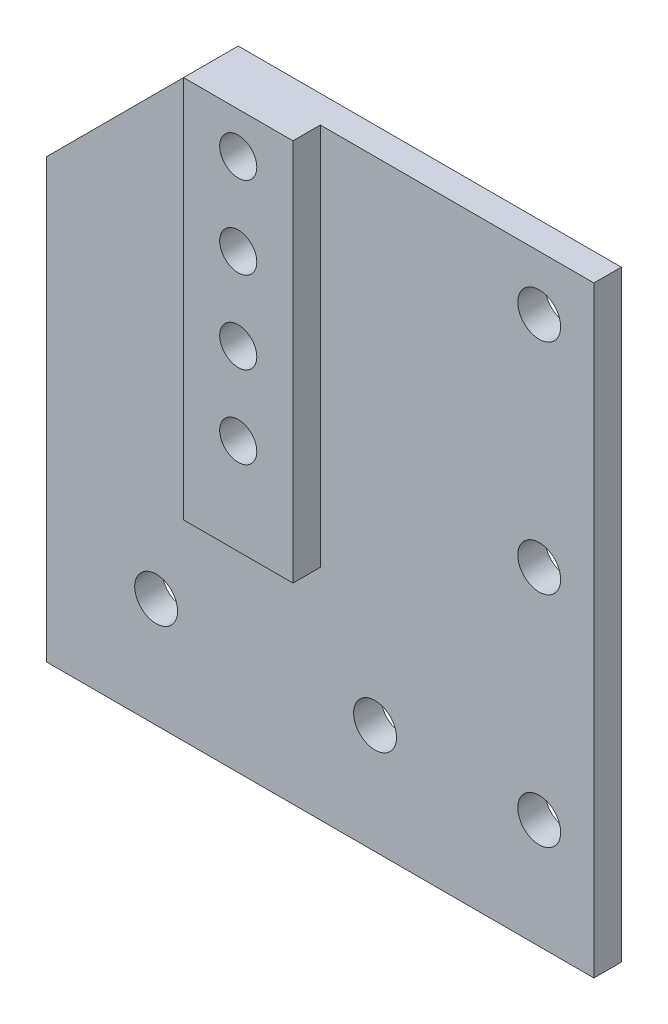
ISO-10303-21;
HEADER;
FILE_DESCRIPTION(('STEP AP214'),'2;1');
FILE_NAME('part.step','',(''),(''),'','','');
FILE_SCHEMA(('AUTOMOTIVE_DESIGN { 1 0 10303 214 1 1 1 1 }'));
ENDSEC;
DATA;
#1=APPLICATION_CONTEXT('core data for automotive mechanical design processes');
#2=APPLICATION_PROTOCOL_DEFINITION('international standard','automotive_design',2000,#1);
#3=PRODUCT_CONTEXT('',#1,'mechanical');
#4=PRODUCT('Part','Part','',(#3));
#5=PRODUCT_RELATED_PRODUCT_CATEGORY('part','',(#4));
#6=PRODUCT_DEFINITION_FORMATION('','',#4);
#7=PRODUCT_DEFINITION_CONTEXT('part definition',#1,'design');
#8=PRODUCT_DEFINITION('design','',#6,#7);
#9=PRODUCT_DEFINITION_SHAPE('','',#8);
#10=(LENGTH_UNIT() NAMED_UNIT(*) SI_UNIT(.MILLI.,.METRE.));
#11=(NAMED_UNIT(*) PLANE_ANGLE_UNIT() SI_UNIT($,.RADIAN.));
#12=(NAMED_UNIT(*) SI_UNIT($,.STERADIAN.) SOLID_ANGLE_UNIT());
#13=UNCERTAINTY_MEASURE_WITH_UNIT(LENGTH_MEASURE(1.E-05),#10,'distance_accuracy_value','');
#14=(GEOMETRIC_REPRESENTATION_CONTEXT(3) GLOBAL_UNCERTAINTY_ASSIGNED_CONTEXT((#13)) GLOBAL_UNIT_ASSIGNED_CONTEXT((#10,
#11,#12)) REPRESENTATION_CONTEXT('',''));
#15=CARTESIAN_POINT('',(0.,0.,0.));
#16=DIRECTION('',(0.,0.,1.));
#17=DIRECTION('',(1.,0.,0.));
#18=AXIS2_PLACEMENT_3D('',#15,#16,#17);
#19=CARTESIAN_POINT('',(0.,0.,3.175));
#20=DIRECTION('',(0.,0.,-1.));
#21=DIRECTION('',(-1.,0.,0.));
#22=AXIS2_PLACEMENT_3D('',#19,#20,#21);
#23=PLANE('',#22);
#24=CARTESIAN_POINT('',(-273.050000508,50.8000000000182,3.175));
#25=DIRECTION('',(0.,0.,1.));
#26=DIRECTION('',(1.,0.,0.));
#27=AXIS2_PLACEMENT_3D('',#24,#25,#26);
#28=CIRCLE('',#27,2.48919999999997);
#29=CARTESIAN_POINT('',(-270.560800508,50.8000000000182,3.175));
#30=VERTEX_POINT('',#29);
#31=EDGE_CURVE('E141',#30,#30,#28,.T.);
#32=ORIENTED_EDGE('',*,*,#31,.F.);
#33=EDGE_LOOP('',(#32));
#34=FACE_BOUND('',#33,.T.);
#35=CARTESIAN_POINT('',(-292.100000508,-4.02802791121815E-12,3.175));
#36=DIRECTION('',(0.,0.,1.));
#37=DIRECTION('',(1.,0.,0.));
#38=AXIS2_PLACEMENT_3D('',#35,#36,#37);
#39=CIRCLE('',#38,2.48919999999997);
#40=CARTESIAN_POINT('',(-289.610800508,-4.02802791121815E-12,3.175));
#41=VERTEX_POINT('',#40);
#42=EDGE_CURVE('E181',#41,#41,#39,.T.);
#43=ORIENTED_EDGE('',*,*,#42,.F.);
#44=EDGE_LOOP('',(#43));
#45=FACE_BOUND('',#44,.T.);
#46=CARTESIAN_POINT('',(-317.500000508,-4.02802791121815E-12,3.175));
#47=DIRECTION('',(0.,0.,1.));
#48=DIRECTION('',(1.,0.,0.));
#49=AXIS2_PLACEMENT_3D('',#46,#47,#48);
#50=CIRCLE('',#49,2.48919999999997);
#51=CARTESIAN_POINT('',(-315.010800508,-4.02802791121815E-12,3.175));
#52=VERTEX_POINT('',#51);
#53=EDGE_CURVE('E173',#52,#52,#50,.T.);
#54=ORIENTED_EDGE('',*,*,#53,.F.);
#55=EDGE_LOOP('',(#54));
#56=FACE_BOUND('',#55,.T.);
#57=CARTESIAN_POINT('',(-273.050000508,1.79465004055551E-11,3.175));
#58=DIRECTION('',(0.,0.,1.));
#59=DIRECTION('',(1.,0.,0.));
#60=AXIS2_PLACEMENT_3D('',#57,#58,#59);
#61=CIRCLE('',#60,2.48919999999997);
#62=CARTESIAN_POINT('',(-270.560800508,1.79465004055551E-11,3.175));
#63=VERTEX_POINT('',#62);
#64=EDGE_CURVE('E165',#63,#63,#61,.T.);
#65=ORIENTED_EDGE('',*,*,#64,.F.);
#66=EDGE_LOOP('',(#65));
#67=FACE_BOUND('',#66,.T.);
#68=CARTESIAN_POINT('',(-273.050000508,25.400000000017,3.175));
#69=DIRECTION('',(0.,0.,1.));
#70=DIRECTION('',(1.,0.,0.));
#71=AXIS2_PLACEMENT_3D('',#68,#69,#70);
#72=CIRCLE('',#71,2.48919999999997);
#73=CARTESIAN_POINT('',(-270.560800508,25.400000000017,3.175));
#74=VERTEX_POINT('',#73);
#75=EDGE_CURVE('E157',#74,#74,#72,.T.);
#76=ORIENTED_EDGE('',*,*,#75,.F.);
#77=EDGE_LOOP('',(#76));
#78=FACE_BOUND('',#77,.T.);
#79=DIRECTION('',(0.,1.,0.));
#80=VECTOR('',#79,1.);
#81=CARTESIAN_POINT('',(-298.450000508,12.6999999999997,3.175));
#82=LINE('',#81,#80);
#83=CARTESIAN_POINT('',(-298.450000508,12.6999999999997,3.175));
#84=VERTEX_POINT('',#83);
#85=CARTESIAN_POINT('',(-298.450000508,57.1499999999997,3.175));
#86=VERTEX_POINT('',#85);
#87=EDGE_CURVE('E61',#84,#86,#82,.T.);
#88=ORIENTED_EDGE('',*,*,#87,.F.);
#89=DIRECTION('',(1.,0.,0.));
#90=VECTOR('',#89,1.);
#91=CARTESIAN_POINT('',(-311.150000508,12.6999999999997,3.175));
#92=LINE('',#91,#90);
#93=CARTESIAN_POINT('',(-311.150000508,12.6999999999997,3.175));
#94=VERTEX_POINT('',#93);
#95=EDGE_CURVE('E253',#94,#84,#92,.T.);
#96=ORIENTED_EDGE('',*,*,#95,.F.);
#97=DIRECTION('',(0.,-1.,0.));
#98=VECTOR('',#97,1.);
#99=CARTESIAN_POINT('',(-311.150000508,57.1499999999997,3.175));
#100=LINE('',#99,#98);
#101=CARTESIAN_POINT('',(-311.150000508,57.1499999999997,3.175));
#102=VERTEX_POINT('',#101);
#103=EDGE_CURVE('E252',#102,#94,#100,.T.);
#104=ORIENTED_EDGE('',*,*,#103,.F.);
#105=DIRECTION('',(-0.707106781186543,-0.707106781186552,0.));
#106=VECTOR('',#105,1.);
#107=CARTESIAN_POINT('',(-311.150000508,57.1499999999997,3.175));
#108=LINE('',#107,#106);
#109=CARTESIAN_POINT('',(-330.200000508,38.0999999999996,3.175));
#110=VERTEX_POINT('',#109);
#111=EDGE_CURVE('E199',#102,#110,#108,.T.);
#112=ORIENTED_EDGE('',*,*,#111,.T.);
#113=DIRECTION('',(0.,-1.,0.));
#114=VECTOR('',#113,1.);
#115=CARTESIAN_POINT('',(-330.200000508,12.6999999999996,3.175));
#116=LINE('',#115,#114);
#117=CARTESIAN_POINT('',(-330.200000508,-12.7000000000004,3.175));
#118=VERTEX_POINT('',#117);
#119=EDGE_CURVE('E202',#110,#118,#116,.T.);
#120=ORIENTED_EDGE('',*,*,#119,.T.);
#121=DIRECTION('',(1.,0.,0.));
#122=VECTOR('',#121,1.);
#123=CARTESIAN_POINT('',(-279.400000508,-12.7000000000001,3.175));
#124=LINE('',#123,#122);
#125=CARTESIAN_POINT('',(-266.700000508,-12.7,3.175));
#126=VERTEX_POINT('',#125);
#127=EDGE_CURVE('E190',#118,#126,#124,.T.);
#128=ORIENTED_EDGE('',*,*,#127,.T.);
#129=DIRECTION('',(0.,1.,0.));
#130=VECTOR('',#129,1.);
#131=CARTESIAN_POINT('',(-266.700000508,-12.7,3.175));
#132=LINE('',#131,#130);
#133=CARTESIAN_POINT('',(-266.700000508,57.1499999999999,3.175));
#134=VERTEX_POINT('',#133);
#135=EDGE_CURVE('E193',#126,#134,#132,.T.);
#136=ORIENTED_EDGE('',*,*,#135,.T.);
#137=DIRECTION('',(-1.,0.,0.));
#138=VECTOR('',#137,1.);
#139=CARTESIAN_POINT('',(-266.700000508,57.1499999999999,3.175));
#140=LINE('',#139,#138);
#141=EDGE_CURVE('E66',#134,#86,#140,.T.);
#142=ORIENTED_EDGE('',*,*,#141,.T.);
#143=EDGE_LOOP('',(#88,#96,#104,#112,#120,#128,#136,#142));
#144=FACE_BOUND('',#143,.T.);
#145=ADVANCED_FACE('F45',(#34,#45,#56,#67,#78,#144),#23,.F.);
#146=CARTESIAN_POINT('',(0.,0.,0.));
#147=DIRECTION('',(0.,0.,-1.));
#148=DIRECTION('',(-1.,0.,0.));
#149=AXIS2_PLACEMENT_3D('',#146,#147,#148);
#150=PLANE('',#149);
#151=CARTESIAN_POINT('',(-304.800000508,42.8624999999998,0.));
#152=DIRECTION('',(0.,0.,1.));
#153=DIRECTION('',(1.,0.,0.));
#154=AXIS2_PLACEMENT_3D('',#151,#152,#153);
#155=CIRCLE('',#154,2.15264999999998);
#156=CARTESIAN_POINT('',(-302.647350508,42.8624999999998,0.));
#157=VERTEX_POINT('',#156);
#158=EDGE_CURVE('E305',#157,#157,#155,.T.);
#159=ORIENTED_EDGE('',*,*,#158,.T.);
#160=EDGE_LOOP('',(#159));
#161=FACE_BOUND('',#160,.T.);
#162=CARTESIAN_POINT('',(-304.800000508,52.3874999999998,0.));
#163=DIRECTION('',(0.,0.,1.));
#164=DIRECTION('',(1.,0.,0.));
#165=AXIS2_PLACEMENT_3D('',#162,#163,#164);
#166=CIRCLE('',#165,2.15264999999998);
#167=CARTESIAN_POINT('',(-302.647350508,52.3874999999998,0.));
#168=VERTEX_POINT('',#167);
#169=EDGE_CURVE('E297',#168,#168,#166,.T.);
#170=ORIENTED_EDGE('',*,*,#169,.T.);
#171=EDGE_LOOP('',(#170));
#172=FACE_BOUND('',#171,.T.);
#173=CARTESIAN_POINT('',(-304.800000508,33.3374999999998,0.));
#174=DIRECTION('',(0.,0.,1.));
#175=DIRECTION('',(1.,0.,0.));
#176=AXIS2_PLACEMENT_3D('',#173,#174,#175);
#177=CIRCLE('',#176,2.15264999999998);
#178=CARTESIAN_POINT('',(-302.647350508,33.3374999999998,0.));
#179=VERTEX_POINT('',#178);
#180=EDGE_CURVE('E289',#179,#179,#177,.T.);
#181=ORIENTED_EDGE('',*,*,#180,.T.);
#182=EDGE_LOOP('',(#181));
#183=FACE_BOUND('',#182,.T.);
#184=CARTESIAN_POINT('',(-304.800000508,23.8124999999998,0.));
#185=DIRECTION('',(0.,0.,1.));
#186=DIRECTION('',(1.,0.,0.));
#187=AXIS2_PLACEMENT_3D('',#184,#185,#186);
#188=CIRCLE('',#187,2.15264999999998);
#189=CARTESIAN_POINT('',(-302.647350508,23.8124999999998,0.));
#190=VERTEX_POINT('',#189);
#191=EDGE_CURVE('E255',#190,#190,#188,.T.);
#192=ORIENTED_EDGE('',*,*,#191,.T.);
#193=EDGE_LOOP('',(#192));
#194=FACE_BOUND('',#193,.T.);
#195=CARTESIAN_POINT('',(-273.050000508,50.8000000000182,0.));
#196=DIRECTION('',(0.,0.,1.));
#197=DIRECTION('',(1.,0.,0.));
#198=AXIS2_PLACEMENT_3D('',#195,#196,#197);
#199=CIRCLE('',#198,2.48920000000002);
#200=CARTESIAN_POINT('',(-270.560800508,50.8000000000182,0.));
#201=VERTEX_POINT('',#200);
#202=EDGE_CURVE('E148',#201,#201,#199,.T.);
#203=ORIENTED_EDGE('',*,*,#202,.T.);
#204=EDGE_LOOP('',(#203));
#205=FACE_BOUND('',#204,.T.);
#206=CARTESIAN_POINT('',(-273.050000508,25.400000000017,0.));
#207=DIRECTION('',(0.,0.,1.));
#208=DIRECTION('',(1.,0.,0.));
#209=AXIS2_PLACEMENT_3D('',#206,#207,#208);
#210=CIRCLE('',#209,2.48920000000002);
#211=CARTESIAN_POINT('',(-270.560800508,25.400000000017,0.));
#212=VERTEX_POINT('',#211);
#213=EDGE_CURVE('E161',#212,#212,#210,.T.);
#214=ORIENTED_EDGE('',*,*,#213,.T.);
#215=EDGE_LOOP('',(#214));
#216=FACE_BOUND('',#215,.T.);
#217=DIRECTION('',(1.,0.,0.));
#218=VECTOR('',#217,1.);
#219=CARTESIAN_POINT('',(-279.400000508,-12.7000000000001,0.));
#220=LINE('',#219,#218);
#221=CARTESIAN_POINT('',(-330.200000508,-12.7000000000004,0.));
#222=VERTEX_POINT('',#221);
#223=CARTESIAN_POINT('',(-266.700000508,-12.7,0.));
#224=VERTEX_POINT('',#223);
#225=EDGE_CURVE('E189',#222,#224,#220,.T.);
#226=ORIENTED_EDGE('',*,*,#225,.F.);
#227=DIRECTION('',(0.,-1.,0.));
#228=VECTOR('',#227,1.);
#229=CARTESIAN_POINT('',(-330.200000508,-12.7000000000004,0.));
#230=LINE('',#229,#228);
#231=CARTESIAN_POINT('',(-330.200000508,38.0999999999996,0.));
#232=VERTEX_POINT('',#231);
#233=EDGE_CURVE('E194',#232,#222,#230,.T.);
#234=ORIENTED_EDGE('',*,*,#233,.F.);
#235=DIRECTION('',(-0.707106781186543,-0.707106781186552,0.));
#236=VECTOR('',#235,1.);
#237=CARTESIAN_POINT('',(-311.150000508,57.1499999999997,0.));
#238=LINE('',#237,#236);
#239=CARTESIAN_POINT('',(-311.150000508,57.1499999999997,0.));
#240=VERTEX_POINT('',#239);
#241=EDGE_CURVE('E215',#240,#232,#238,.T.);
#242=ORIENTED_EDGE('',*,*,#241,.F.);
#243=DIRECTION('',(-1.,0.,0.));
#244=VECTOR('',#243,1.);
#245=CARTESIAN_POINT('',(-279.400000508,57.1499999999999,0.));
#246=LINE('',#245,#244);
#247=CARTESIAN_POINT('',(-266.700000508,57.1499999999999,0.));
#248=VERTEX_POINT('',#247);
#249=EDGE_CURVE('E212',#248,#240,#246,.T.);
#250=ORIENTED_EDGE('',*,*,#249,.F.);
#251=DIRECTION('',(0.,1.,0.));
#252=VECTOR('',#251,1.);
#253=CARTESIAN_POINT('',(-266.700000508,-12.7,0.));
#254=LINE('',#253,#252);
#255=EDGE_CURVE('E208',#224,#248,#254,.T.);
#256=ORIENTED_EDGE('',*,*,#255,.F.);
#257=EDGE_LOOP('',(#226,#234,#242,#250,#256));
#258=FACE_BOUND('',#257,.T.);
#259=CARTESIAN_POINT('',(-292.100000508,-4.02802791121815E-12,0.));
#260=DIRECTION('',(0.,0.,1.));
#261=DIRECTION('',(1.,0.,0.));
#262=AXIS2_PLACEMENT_3D('',#259,#260,#261);
#263=CIRCLE('',#262,2.48920000000002);
#264=CARTESIAN_POINT('',(-289.610800508,-4.02802791121815E-12,0.));
#265=VERTEX_POINT('',#264);
#266=EDGE_CURVE('E185',#265,#265,#263,.T.);
#267=ORIENTED_EDGE('',*,*,#266,.T.);
#268=EDGE_LOOP('',(#267));
#269=FACE_BOUND('',#268,.T.);
#270=CARTESIAN_POINT('',(-317.500000508,-4.02802791121815E-12,0.));
#271=DIRECTION('',(0.,0.,1.));
#272=DIRECTION('',(1.,0.,0.));
#273=AXIS2_PLACEMENT_3D('',#270,#271,#272);
#274=CIRCLE('',#273,2.48920000000002);
#275=CARTESIAN_POINT('',(-315.010800508,-4.02802791121815E-12,0.));
#276=VERTEX_POINT('',#275);
#277=EDGE_CURVE('E177',#276,#276,#274,.T.);
#278=ORIENTED_EDGE('',*,*,#277,.T.);
#279=EDGE_LOOP('',(#278));
#280=FACE_BOUND('',#279,.T.);
#281=CARTESIAN_POINT('',(-273.050000508,1.79465004055551E-11,0.));
#282=DIRECTION('',(0.,0.,1.));
#283=DIRECTION('',(1.,0.,0.));
#284=AXIS2_PLACEMENT_3D('',#281,#282,#283);
#285=CIRCLE('',#284,2.48920000000002);
#286=CARTESIAN_POINT('',(-270.560800508,1.79465004055551E-11,0.));
#287=VERTEX_POINT('',#286);
#288=EDGE_CURVE('E169',#287,#287,#285,.T.);
#289=ORIENTED_EDGE('',*,*,#288,.T.);
#290=EDGE_LOOP('',(#289));
#291=FACE_BOUND('',#290,.T.);
#292=ADVANCED_FACE('F241',(#161,#172,#183,#194,#205,#216,#258,#269,#280,#291),#150,.T.);
#293=CARTESIAN_POINT('',(-279.400000508,-12.7000000000001,3.175));
#294=DIRECTION('',(0.,1.,0.));
#295=DIRECTION('',(-1.,0.,0.));
#296=AXIS2_PLACEMENT_3D('',#293,#294,#295);
#297=PLANE('',#296);
#298=ORIENTED_EDGE('',*,*,#225,.T.);
#299=DIRECTION('',(0.,0.,-1.));
#300=VECTOR('',#299,1.);
#301=CARTESIAN_POINT('',(-266.700000508,-12.7,3.175));
#302=LINE('',#301,#300);
#303=EDGE_CURVE('E11',#126,#224,#302,.T.);
#304=ORIENTED_EDGE('',*,*,#303,.F.);
#305=ORIENTED_EDGE('',*,*,#127,.F.);
#306=DIRECTION('',(0.,0.,-1.));
#307=VECTOR('',#306,1.);
#308=CARTESIAN_POINT('',(-330.200000508,-12.7000000000004,3.175));
#309=LINE('',#308,#307);
#310=EDGE_CURVE('E205',#118,#222,#309,.T.);
#311=ORIENTED_EDGE('',*,*,#310,.T.);
#312=EDGE_LOOP('',(#298,#304,#305,#311));
#313=FACE_BOUND('',#312,.T.);
#314=ADVANCED_FACE('F47',(#313),#297,.F.);
#315=CARTESIAN_POINT('',(-266.700000508,-12.7,3.175));
#316=DIRECTION('',(-1.,0.,0.));
#317=DIRECTION('',(0.,-1.,0.));
#318=AXIS2_PLACEMENT_3D('',#315,#316,#317);
#319=PLANE('',#318);
#320=ORIENTED_EDGE('',*,*,#255,.T.);
#321=DIRECTION('',(0.,0.,-1.));
#322=VECTOR('',#321,1.);
#323=CARTESIAN_POINT('',(-266.700000508,57.1499999999999,3.175));
#324=LINE('',#323,#322);
#325=EDGE_CURVE('E54',#134,#248,#324,.T.);
#326=ORIENTED_EDGE('',*,*,#325,.F.);
#327=ORIENTED_EDGE('',*,*,#135,.F.);
#328=ORIENTED_EDGE('',*,*,#303,.T.);
#329=EDGE_LOOP('',(#320,#326,#327,#328));
#330=FACE_BOUND('',#329,.T.);
#331=ADVANCED_FACE('F237',(#330),#319,.F.);
#332=CARTESIAN_POINT('',(-279.400000508,57.1499999999999,3.175));
#333=DIRECTION('',(0.,-1.,0.));
#334=DIRECTION('',(1.,0.,0.));
#335=AXIS2_PLACEMENT_3D('',#332,#333,#334);
#336=PLANE('',#335);
#337=ORIENTED_EDGE('',*,*,#249,.T.);
#338=DIRECTION('',(0.,0.,-1.));
#339=VECTOR('',#338,1.);
#340=CARTESIAN_POINT('',(-311.150000508,57.1499999999997,3.175));
#341=LINE('',#340,#339);
#342=EDGE_CURVE('E138',#102,#240,#341,.T.);
#343=ORIENTED_EDGE('',*,*,#342,.F.);
#344=DIRECTION('',(0.,0.,-1.));
#345=VECTOR('',#344,1.);
#346=CARTESIAN_POINT('',(-311.150000508,57.1499999999997,6.35));
#347=LINE('',#346,#345);
#348=CARTESIAN_POINT('',(-311.150000508,57.1499999999997,6.35));
#349=VERTEX_POINT('',#348);
#350=EDGE_CURVE('E117',#349,#102,#347,.T.);
#351=ORIENTED_EDGE('',*,*,#350,.F.);
#352=DIRECTION('',(-1.,0.,0.));
#353=VECTOR('',#352,1.);
#354=CARTESIAN_POINT('',(-298.450000508,57.1499999999999,6.35));
#355=LINE('',#354,#353);
#356=CARTESIAN_POINT('',(-298.450000508,57.1499999999999,6.35));
#357=VERTEX_POINT('',#356);
#358=EDGE_CURVE('E124',#357,#349,#355,.T.);
#359=ORIENTED_EDGE('',*,*,#358,.F.);
#360=DIRECTION('',(0.,0.,-1.));
#361=VECTOR('',#360,1.);
#362=CARTESIAN_POINT('',(-298.450000508,57.1499999999999,6.35));
#363=LINE('',#362,#361);
#364=EDGE_CURVE('E270',#357,#86,#363,.T.);
#365=ORIENTED_EDGE('',*,*,#364,.T.);
#366=ORIENTED_EDGE('',*,*,#141,.F.);
#367=ORIENTED_EDGE('',*,*,#325,.T.);
#368=EDGE_LOOP('',(#337,#343,#351,#359,#365,#366,#367));
#369=FACE_BOUND('',#368,.T.);
#370=ADVANCED_FACE('F136',(#369),#336,.F.);
#371=CARTESIAN_POINT('',(-311.150000508,57.1499999999997,3.175));
#372=DIRECTION('',(0.707106781186552,-0.707106781186543,0.));
#373=DIRECTION('',(0.707106781186543,0.707106781186552,0.));
#374=AXIS2_PLACEMENT_3D('',#371,#372,#373);
#375=PLANE('',#374);
#376=ORIENTED_EDGE('',*,*,#241,.T.);
#377=DIRECTION('',(0.,0.,-1.));
#378=VECTOR('',#377,1.);
#379=CARTESIAN_POINT('',(-330.200000508,38.0999999999996,3.175));
#380=LINE('',#379,#378);
#381=EDGE_CURVE('E225',#110,#232,#380,.T.);
#382=ORIENTED_EDGE('',*,*,#381,.F.);
#383=ORIENTED_EDGE('',*,*,#111,.F.);
#384=ORIENTED_EDGE('',*,*,#342,.T.);
#385=EDGE_LOOP('',(#376,#382,#383,#384));
#386=FACE_BOUND('',#385,.T.);
#387=ADVANCED_FACE('F246',(#386),#375,.F.);
#388=CARTESIAN_POINT('',(-330.200000508,-12.7000000000004,3.175));
#389=DIRECTION('',(1.,0.,0.));
#390=DIRECTION('',(0.,1.,0.));
#391=AXIS2_PLACEMENT_3D('',#388,#389,#390);
#392=PLANE('',#391);
#393=ORIENTED_EDGE('',*,*,#233,.T.);
#394=ORIENTED_EDGE('',*,*,#310,.F.);
#395=ORIENTED_EDGE('',*,*,#119,.F.);
#396=ORIENTED_EDGE('',*,*,#381,.T.);
#397=EDGE_LOOP('',(#393,#394,#395,#396));
#398=FACE_BOUND('',#397,.T.);
#399=ADVANCED_FACE('F249',(#398),#392,.F.);
#400=CARTESIAN_POINT('',(-292.100000508,-4.02802791121815E-12,3.175));
#401=DIRECTION('',(0.,0.,1.));
#402=DIRECTION('',(1.,0.,0.));
#403=AXIS2_PLACEMENT_3D('',#400,#401,#402);
#404=CYLINDRICAL_SURFACE('',#403,2.4892);
#405=ORIENTED_EDGE('',*,*,#266,.F.);
#406=EDGE_LOOP('',(#405));
#407=FACE_BOUND('',#406,.T.);
#408=ORIENTED_EDGE('',*,*,#42,.T.);
#409=EDGE_LOOP('',(#408));
#410=FACE_BOUND('',#409,.T.);
#411=ADVANCED_FACE('F350',(#407,#410),#404,.F.);
#412=CARTESIAN_POINT('',(-317.500000508,-4.02802791121815E-12,3.175));
#413=DIRECTION('',(0.,0.,1.));
#414=DIRECTION('',(1.,0.,0.));
#415=AXIS2_PLACEMENT_3D('',#412,#413,#414);
#416=CYLINDRICAL_SURFACE('',#415,2.4892);
#417=ORIENTED_EDGE('',*,*,#277,.F.);
#418=EDGE_LOOP('',(#417));
#419=FACE_BOUND('',#418,.T.);
#420=ORIENTED_EDGE('',*,*,#53,.T.);
#421=EDGE_LOOP('',(#420));
#422=FACE_BOUND('',#421,.T.);
#423=ADVANCED_FACE('F476',(#419,#422),#416,.F.);
#424=CARTESIAN_POINT('',(-273.050000508,1.79465004055551E-11,3.175));
#425=DIRECTION('',(0.,0.,1.));
#426=DIRECTION('',(1.,0.,0.));
#427=AXIS2_PLACEMENT_3D('',#424,#425,#426);
#428=CYLINDRICAL_SURFACE('',#427,2.4892);
#429=ORIENTED_EDGE('',*,*,#288,.F.);
#430=EDGE_LOOP('',(#429));
#431=FACE_BOUND('',#430,.T.);
#432=ORIENTED_EDGE('',*,*,#64,.T.);
#433=EDGE_LOOP('',(#432));
#434=FACE_BOUND('',#433,.T.);
#435=ADVANCED_FACE('F466',(#431,#434),#428,.F.);
#436=CARTESIAN_POINT('',(-273.050000508,25.400000000017,3.175));
#437=DIRECTION('',(0.,0.,1.));
#438=DIRECTION('',(1.,0.,0.));
#439=AXIS2_PLACEMENT_3D('',#436,#437,#438);
#440=CYLINDRICAL_SURFACE('',#439,2.4892);
#441=ORIENTED_EDGE('',*,*,#213,.F.);
#442=EDGE_LOOP('',(#441));
#443=FACE_BOUND('',#442,.T.);
#444=ORIENTED_EDGE('',*,*,#75,.T.);
#445=EDGE_LOOP('',(#444));
#446=FACE_BOUND('',#445,.T.);
#447=ADVANCED_FACE('F456',(#443,#446),#440,.F.);
#448=CARTESIAN_POINT('',(-273.050000508,50.8000000000182,3.175));
#449=DIRECTION('',(0.,0.,1.));
#450=DIRECTION('',(1.,0.,0.));
#451=AXIS2_PLACEMENT_3D('',#448,#449,#450);
#452=CYLINDRICAL_SURFACE('',#451,2.4892);
#453=ORIENTED_EDGE('',*,*,#202,.F.);
#454=EDGE_LOOP('',(#453));
#455=FACE_BOUND('',#454,.T.);
#456=ORIENTED_EDGE('',*,*,#31,.T.);
#457=EDGE_LOOP('',(#456));
#458=FACE_BOUND('',#457,.T.);
#459=ADVANCED_FACE('F441',(#455,#458),#452,.F.);
#460=CARTESIAN_POINT('',(-311.150000508,57.1499999999997,6.35));
#461=DIRECTION('',(1.,0.,0.));
#462=DIRECTION('',(0.,0.,-1.));
#463=AXIS2_PLACEMENT_3D('',#460,#461,#462);
#464=PLANE('',#463);
#465=ORIENTED_EDGE('',*,*,#103,.T.);
#466=DIRECTION('',(0.,0.,-1.));
#467=VECTOR('',#466,1.);
#468=CARTESIAN_POINT('',(-311.150000508,12.6999999999997,6.35));
#469=LINE('',#468,#467);
#470=CARTESIAN_POINT('',(-311.150000508,12.6999999999997,6.35));
#471=VERTEX_POINT('',#470);
#472=EDGE_CURVE('E119',#471,#94,#469,.T.);
#473=ORIENTED_EDGE('',*,*,#472,.F.);
#474=DIRECTION('',(0.,-1.,0.));
#475=VECTOR('',#474,1.);
#476=CARTESIAN_POINT('',(-311.150000508,57.1499999999997,6.35));
#477=LINE('',#476,#475);
#478=EDGE_CURVE('E112',#349,#471,#477,.T.);
#479=ORIENTED_EDGE('',*,*,#478,.F.);
#480=ORIENTED_EDGE('',*,*,#350,.T.);
#481=EDGE_LOOP('',(#465,#473,#479,#480));
#482=FACE_BOUND('',#481,.T.);
#483=ADVANCED_FACE('F115',(#482),#464,.F.);
#484=CARTESIAN_POINT('',(-311.150000508,12.6999999999997,6.35));
#485=DIRECTION('',(0.,1.,0.));
#486=DIRECTION('',(-1.,0.,0.));
#487=AXIS2_PLACEMENT_3D('',#484,#485,#486);
#488=PLANE('',#487);
#489=ORIENTED_EDGE('',*,*,#95,.T.);
#490=DIRECTION('',(0.,0.,-1.));
#491=VECTOR('',#490,1.);
#492=CARTESIAN_POINT('',(-298.450000508,12.6999999999997,6.35));
#493=LINE('',#492,#491);
#494=CARTESIAN_POINT('',(-298.450000508,12.6999999999997,6.35));
#495=VERTEX_POINT('',#494);
#496=EDGE_CURVE('E150',#495,#84,#493,.T.);
#497=ORIENTED_EDGE('',*,*,#496,.F.);
#498=DIRECTION('',(1.,0.,0.));
#499=VECTOR('',#498,1.);
#500=CARTESIAN_POINT('',(-311.150000508,12.6999999999997,6.35));
#501=LINE('',#500,#499);
#502=EDGE_CURVE('E123',#471,#495,#501,.T.);
#503=ORIENTED_EDGE('',*,*,#502,.F.);
#504=ORIENTED_EDGE('',*,*,#472,.T.);
#505=EDGE_LOOP('',(#489,#497,#503,#504));
#506=FACE_BOUND('',#505,.T.);
#507=ADVANCED_FACE('F280',(#506),#488,.F.);
#508=CARTESIAN_POINT('',(-298.450000508,12.6999999999997,6.35));
#509=DIRECTION('',(-1.,0.,0.));
#510=DIRECTION('',(0.,0.,1.));
#511=AXIS2_PLACEMENT_3D('',#508,#509,#510);
#512=PLANE('',#511);
#513=ORIENTED_EDGE('',*,*,#87,.T.);
#514=ORIENTED_EDGE('',*,*,#364,.F.);
#515=DIRECTION('',(0.,1.,0.));
#516=VECTOR('',#515,1.);
#517=CARTESIAN_POINT('',(-298.450000508,12.6999999999997,6.35));
#518=LINE('',#517,#516);
#519=EDGE_CURVE('E129',#495,#357,#518,.T.);
#520=ORIENTED_EDGE('',*,*,#519,.F.);
#521=ORIENTED_EDGE('',*,*,#496,.T.);
#522=EDGE_LOOP('',(#513,#514,#520,#521));
#523=FACE_BOUND('',#522,.T.);
#524=ADVANCED_FACE('F278',(#523),#512,.F.);
#525=CARTESIAN_POINT('',(0.,0.,6.35));
#526=DIRECTION('',(0.,0.,1.));
#527=DIRECTION('',(1.,0.,0.));
#528=AXIS2_PLACEMENT_3D('',#525,#526,#527);
#529=PLANE('',#528);
#530=CARTESIAN_POINT('',(-304.800000508,42.8624999999998,6.35));
#531=DIRECTION('',(0.,0.,1.));
#532=DIRECTION('',(1.,0.,0.));
#533=AXIS2_PLACEMENT_3D('',#530,#531,#532);
#534=CIRCLE('',#533,2.15264999999998);
#535=CARTESIAN_POINT('',(-302.647350508,42.8624999999998,6.35));
#536=VERTEX_POINT('',#535);
#537=EDGE_CURVE('E309',#536,#536,#534,.T.);
#538=ORIENTED_EDGE('',*,*,#537,.F.);
#539=EDGE_LOOP('',(#538));
#540=FACE_BOUND('',#539,.T.);
#541=CARTESIAN_POINT('',(-304.800000508,52.3874999999998,6.35));
#542=DIRECTION('',(0.,0.,1.));
#543=DIRECTION('',(1.,0.,0.));
#544=AXIS2_PLACEMENT_3D('',#541,#542,#543);
#545=CIRCLE('',#544,2.15264999999998);
#546=CARTESIAN_POINT('',(-302.647350508,52.3874999999998,6.35));
#547=VERTEX_POINT('',#546);
#548=EDGE_CURVE('E301',#547,#547,#545,.T.);
#549=ORIENTED_EDGE('',*,*,#548,.F.);
#550=EDGE_LOOP('',(#549));
#551=FACE_BOUND('',#550,.T.);
#552=CARTESIAN_POINT('',(-304.800000508,33.3374999999998,6.35));
#553=DIRECTION('',(0.,0.,1.));
#554=DIRECTION('',(1.,0.,0.));
#555=AXIS2_PLACEMENT_3D('',#552,#553,#554);
#556=CIRCLE('',#555,2.15264999999998);
#557=CARTESIAN_POINT('',(-302.647350508,33.3374999999998,6.35));
#558=VERTEX_POINT('',#557);
#559=EDGE_CURVE('E293',#558,#558,#556,.T.);
#560=ORIENTED_EDGE('',*,*,#559,.F.);
#561=EDGE_LOOP('',(#560));
#562=FACE_BOUND('',#561,.T.);
#563=CARTESIAN_POINT('',(-304.800000508,23.8124999999998,6.35));
#564=DIRECTION('',(0.,0.,1.));
#565=DIRECTION('',(1.,0.,0.));
#566=AXIS2_PLACEMENT_3D('',#563,#564,#565);
#567=CIRCLE('',#566,2.15264999999998);
#568=CARTESIAN_POINT('',(-302.647350508,23.8124999999998,6.35));
#569=VERTEX_POINT('',#568);
#570=EDGE_CURVE('E263',#569,#569,#567,.T.);
#571=ORIENTED_EDGE('',*,*,#570,.F.);
#572=EDGE_LOOP('',(#571));
#573=FACE_BOUND('',#572,.T.);
#574=ORIENTED_EDGE('',*,*,#358,.T.);
#575=ORIENTED_EDGE('',*,*,#478,.T.);
#576=ORIENTED_EDGE('',*,*,#502,.T.);
#577=ORIENTED_EDGE('',*,*,#519,.T.);
#578=EDGE_LOOP('',(#574,#575,#576,#577));
#579=FACE_BOUND('',#578,.T.);
#580=ADVANCED_FACE('F127',(#540,#551,#562,#573,#579),#529,.T.);
#581=CARTESIAN_POINT('',(-304.800000508,23.8124999999998,6.35));
#582=DIRECTION('',(0.,0.,1.));
#583=DIRECTION('',(1.,0.,0.));
#584=AXIS2_PLACEMENT_3D('',#581,#582,#583);
#585=CYLINDRICAL_SURFACE('',#584,2.15264999999998);
#586=ORIENTED_EDGE('',*,*,#191,.F.);
#587=EDGE_LOOP('',(#586));
#588=FACE_BOUND('',#587,.T.);
#589=ORIENTED_EDGE('',*,*,#570,.T.);
#590=EDGE_LOOP('',(#589));
#591=FACE_BOUND('',#590,.T.);
#592=ADVANCED_FACE('F320',(#588,#591),#585,.F.);
#593=CARTESIAN_POINT('',(-304.800000508,33.3374999999998,6.35));
#594=DIRECTION('',(0.,0.,1.));
#595=DIRECTION('',(1.,0.,0.));
#596=AXIS2_PLACEMENT_3D('',#593,#594,#595);
#597=CYLINDRICAL_SURFACE('',#596,2.15264999999998);
#598=ORIENTED_EDGE('',*,*,#180,.F.);
#599=EDGE_LOOP('',(#598));
#600=FACE_BOUND('',#599,.T.);
#601=ORIENTED_EDGE('',*,*,#559,.T.);
#602=EDGE_LOOP('',(#601));
#603=FACE_BOUND('',#602,.T.);
#604=ADVANCED_FACE('F329',(#600,#603),#597,.F.);
#605=CARTESIAN_POINT('',(-304.800000508,52.3874999999998,6.35));
#606=DIRECTION('',(0.,0.,1.));
#607=DIRECTION('',(1.,0.,0.));
#608=AXIS2_PLACEMENT_3D('',#605,#606,#607);
#609=CYLINDRICAL_SURFACE('',#608,2.15264999999998);
#610=ORIENTED_EDGE('',*,*,#169,.F.);
#611=EDGE_LOOP('',(#610));
#612=FACE_BOUND('',#611,.T.);
#613=ORIENTED_EDGE('',*,*,#548,.T.);
#614=EDGE_LOOP('',(#613));
#615=FACE_BOUND('',#614,.T.);
#616=ADVANCED_FACE('F335',(#612,#615),#609,.F.);
#617=CARTESIAN_POINT('',(-304.800000508,42.8624999999998,6.35));
#618=DIRECTION('',(0.,0.,1.));
#619=DIRECTION('',(1.,0.,0.));
#620=AXIS2_PLACEMENT_3D('',#617,#618,#619);
#621=CYLINDRICAL_SURFACE('',#620,2.15264999999998);
#622=ORIENTED_EDGE('',*,*,#158,.F.);
#623=EDGE_LOOP('',(#622));
#624=FACE_BOUND('',#623,.T.);
#625=ORIENTED_EDGE('',*,*,#537,.T.);
#626=EDGE_LOOP('',(#625));
#627=FACE_BOUND('',#626,.T.);
#628=ADVANCED_FACE('F316',(#624,#627),#621,.F.);
#629=CLOSED_SHELL('',(#145,#292,#314,#331,#370,#387,#399,#411,#423,#435,#447,#459,#483,#507,
#524,#580,#592,#604,#616,#628));
#630=MANIFOLD_SOLID_BREP('B2',#629);
#631=ADVANCED_BREP_SHAPE_REPRESENTATION('',(#18,#630),#14);
#632=SHAPE_DEFINITION_REPRESENTATION(#9,#631);
ENDSEC;
END-ISO-10303-21;
